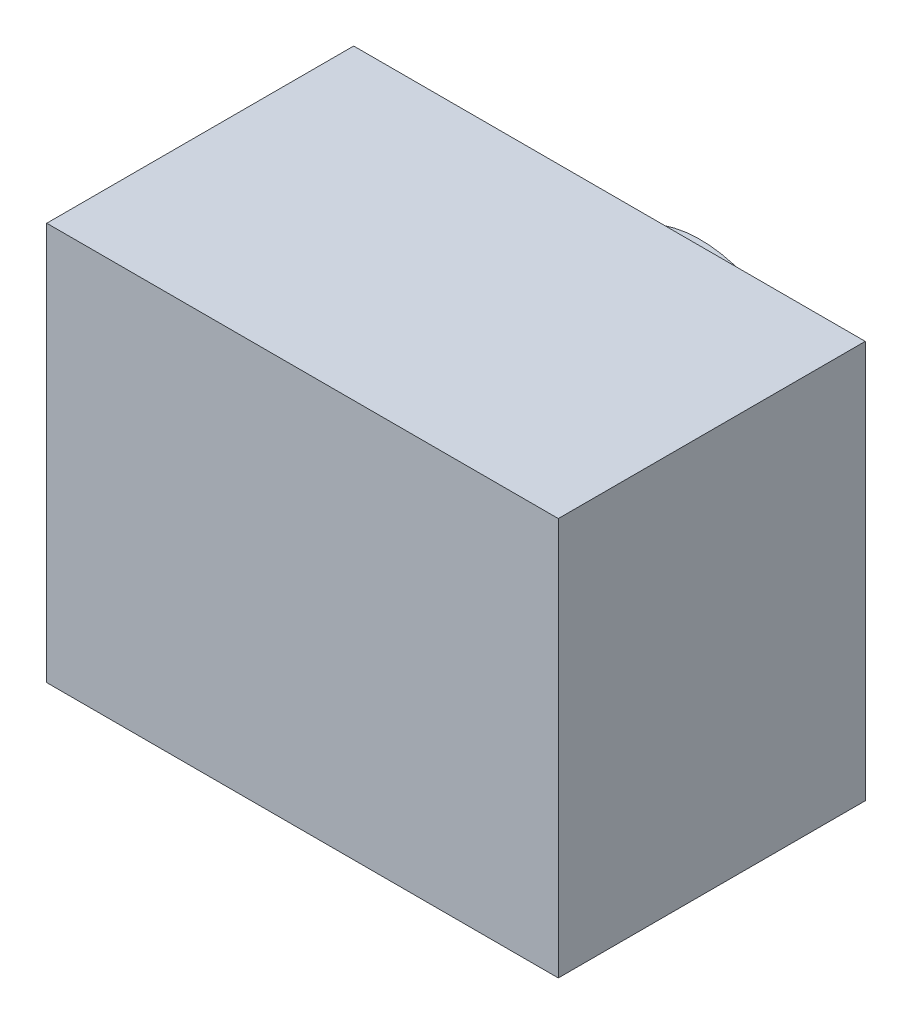
ISO-10303-21;
HEADER;
FILE_DESCRIPTION(('STEP AP214'),'2;1');
FILE_NAME('part.step','',(''),(''),'','','');
FILE_SCHEMA(('AUTOMOTIVE_DESIGN { 1 0 10303 214 1 1 1 1 }'));
ENDSEC;
DATA;
#1=APPLICATION_CONTEXT('core data for automotive mechanical design processes');
#2=APPLICATION_PROTOCOL_DEFINITION('international standard','automotive_design',2000,#1);
#3=PRODUCT_CONTEXT('',#1,'mechanical');
#4=PRODUCT('Part','Part','',(#3));
#5=PRODUCT_RELATED_PRODUCT_CATEGORY('part','',(#4));
#6=PRODUCT_DEFINITION_FORMATION('','',#4);
#7=PRODUCT_DEFINITION_CONTEXT('part definition',#1,'design');
#8=PRODUCT_DEFINITION('design','',#6,#7);
#9=PRODUCT_DEFINITION_SHAPE('','',#8);
#10=(LENGTH_UNIT() NAMED_UNIT(*) SI_UNIT(.MILLI.,.METRE.));
#11=(NAMED_UNIT(*) PLANE_ANGLE_UNIT() SI_UNIT($,.RADIAN.));
#12=(NAMED_UNIT(*) SI_UNIT($,.STERADIAN.) SOLID_ANGLE_UNIT());
#13=UNCERTAINTY_MEASURE_WITH_UNIT(LENGTH_MEASURE(1.E-05),#10,'distance_accuracy_value','');
#14=(GEOMETRIC_REPRESENTATION_CONTEXT(3) GLOBAL_UNCERTAINTY_ASSIGNED_CONTEXT((#13)) GLOBAL_UNIT_ASSIGNED_CONTEXT((#10,
#11,#12)) REPRESENTATION_CONTEXT('',''));
#15=CARTESIAN_POINT('',(0.,0.,0.));
#16=DIRECTION('',(0.,0.,1.));
#17=DIRECTION('',(1.,0.,0.));
#18=AXIS2_PLACEMENT_3D('',#15,#16,#17);
#19=CARTESIAN_POINT('',(0.,0.,0.));
#20=DIRECTION('',(0.,0.,1.));
#21=DIRECTION('',(1.,0.,0.));
#22=AXIS2_PLACEMENT_3D('',#19,#20,#21);
#23=PLANE('',#22);
#24=DIRECTION('',(-1.,0.,0.));
#25=VECTOR('',#24,1.);
#26=CARTESIAN_POINT('',(2.25,1.75,0.));
#27=LINE('',#26,#25);
#28=CARTESIAN_POINT('',(2.25,1.75,0.));
#29=VERTEX_POINT('',#28);
#30=CARTESIAN_POINT('',(-2.25,1.75,0.));
#31=VERTEX_POINT('',#30);
#32=EDGE_CURVE('E81',#29,#31,#27,.T.);
#33=ORIENTED_EDGE('',*,*,#32,.F.);
#34=DIRECTION('',(0.,1.,0.));
#35=VECTOR('',#34,1.);
#36=CARTESIAN_POINT('',(2.25,-1.75,0.));
#37=LINE('',#36,#35);
#38=CARTESIAN_POINT('',(2.25,-1.75,0.));
#39=VERTEX_POINT('',#38);
#40=EDGE_CURVE('E36',#39,#29,#37,.T.);
#41=ORIENTED_EDGE('',*,*,#40,.F.);
#42=DIRECTION('',(1.,0.,0.));
#43=VECTOR('',#42,1.);
#44=CARTESIAN_POINT('',(-2.25,-1.75,0.));
#45=LINE('',#44,#43);
#46=CARTESIAN_POINT('',(-2.25,-1.75,0.));
#47=VERTEX_POINT('',#46);
#48=EDGE_CURVE('E74',#47,#39,#45,.T.);
#49=ORIENTED_EDGE('',*,*,#48,.F.);
#50=DIRECTION('',(0.,-1.,0.));
#51=VECTOR('',#50,1.);
#52=CARTESIAN_POINT('',(-2.25,1.75,0.));
#53=LINE('',#52,#51);
#54=EDGE_CURVE('E27',#31,#47,#53,.T.);
#55=ORIENTED_EDGE('',*,*,#54,.F.);
#56=EDGE_LOOP('',(#33,#41,#49,#55));
#57=FACE_BOUND('',#56,.T.);
#58=CARTESIAN_POINT('',(0.,0.,0.));
#59=DIRECTION('',(0.,0.,-1.));
#60=DIRECTION('',(1.,0.,0.));
#61=AXIS2_PLACEMENT_3D('',#58,#59,#60);
#62=CIRCLE('',#61,1.);
#63=CARTESIAN_POINT('',(1.,0.,0.));
#64=VERTEX_POINT('',#63);
#65=EDGE_CURVE('E85',#64,#64,#62,.T.);
#66=ORIENTED_EDGE('',*,*,#65,.F.);
#67=EDGE_LOOP('',(#66));
#68=FACE_BOUND('',#67,.T.);
#69=ADVANCED_FACE('F17',(#57,#68),#23,.F.);
#70=CARTESIAN_POINT('',(-2.25,1.75,0.));
#71=DIRECTION('',(-1.,0.,0.));
#72=DIRECTION('',(0.,-1.,0.));
#73=AXIS2_PLACEMENT_3D('',#70,#71,#72);
#74=PLANE('',#73);
#75=DIRECTION('',(0.,0.,1.));
#76=VECTOR('',#75,1.);
#77=CARTESIAN_POINT('',(-2.25,-1.75,0.));
#78=LINE('',#77,#76);
#79=CARTESIAN_POINT('',(-2.25,-1.75,2.7));
#80=VERTEX_POINT('',#79);
#81=EDGE_CURVE('E11',#47,#80,#78,.T.);
#82=ORIENTED_EDGE('',*,*,#81,.T.);
#83=DIRECTION('',(0.,-1.,0.));
#84=VECTOR('',#83,1.);
#85=CARTESIAN_POINT('',(-2.25,1.75,2.7));
#86=LINE('',#85,#84);
#87=CARTESIAN_POINT('',(-2.25,1.75,2.7));
#88=VERTEX_POINT('',#87);
#89=EDGE_CURVE('E77',#88,#80,#86,.T.);
#90=ORIENTED_EDGE('',*,*,#89,.F.);
#91=DIRECTION('',(0.,0.,1.));
#92=VECTOR('',#91,1.);
#93=CARTESIAN_POINT('',(-2.25,1.75,0.));
#94=LINE('',#93,#92);
#95=EDGE_CURVE('E83',#31,#88,#94,.T.);
#96=ORIENTED_EDGE('',*,*,#95,.F.);
#97=ORIENTED_EDGE('',*,*,#54,.T.);
#98=EDGE_LOOP('',(#82,#90,#96,#97));
#99=FACE_BOUND('',#98,.T.);
#100=ADVANCED_FACE('F98',(#99),#74,.T.);
#101=CARTESIAN_POINT('',(2.25,1.75,0.));
#102=DIRECTION('',(0.,1.,0.));
#103=DIRECTION('',(-1.,0.,0.));
#104=AXIS2_PLACEMENT_3D('',#101,#102,#103);
#105=PLANE('',#104);
#106=ORIENTED_EDGE('',*,*,#95,.T.);
#107=DIRECTION('',(-1.,0.,0.));
#108=VECTOR('',#107,1.);
#109=CARTESIAN_POINT('',(2.25,1.75,2.7));
#110=LINE('',#109,#108);
#111=CARTESIAN_POINT('',(2.25,1.75,2.7));
#112=VERTEX_POINT('',#111);
#113=EDGE_CURVE('E58',#112,#88,#110,.T.);
#114=ORIENTED_EDGE('',*,*,#113,.F.);
#115=DIRECTION('',(0.,0.,1.));
#116=VECTOR('',#115,1.);
#117=CARTESIAN_POINT('',(2.25,1.75,0.));
#118=LINE('',#117,#116);
#119=EDGE_CURVE('E65',#29,#112,#118,.T.);
#120=ORIENTED_EDGE('',*,*,#119,.F.);
#121=ORIENTED_EDGE('',*,*,#32,.T.);
#122=EDGE_LOOP('',(#106,#114,#120,#121));
#123=FACE_BOUND('',#122,.T.);
#124=ADVANCED_FACE('F93',(#123),#105,.T.);
#125=CARTESIAN_POINT('',(2.25,-1.75,0.));
#126=DIRECTION('',(1.,0.,0.));
#127=DIRECTION('',(0.,1.,0.));
#128=AXIS2_PLACEMENT_3D('',#125,#126,#127);
#129=PLANE('',#128);
#130=ORIENTED_EDGE('',*,*,#119,.T.);
#131=DIRECTION('',(0.,1.,0.));
#132=VECTOR('',#131,1.);
#133=CARTESIAN_POINT('',(2.25,-1.75,2.7));
#134=LINE('',#133,#132);
#135=CARTESIAN_POINT('',(2.25,-1.75,2.7));
#136=VERTEX_POINT('',#135);
#137=EDGE_CURVE('E61',#136,#112,#134,.T.);
#138=ORIENTED_EDGE('',*,*,#137,.F.);
#139=DIRECTION('',(0.,0.,1.));
#140=VECTOR('',#139,1.);
#141=CARTESIAN_POINT('',(2.25,-1.75,0.));
#142=LINE('',#141,#140);
#143=EDGE_CURVE('E64',#39,#136,#142,.T.);
#144=ORIENTED_EDGE('',*,*,#143,.F.);
#145=ORIENTED_EDGE('',*,*,#40,.T.);
#146=EDGE_LOOP('',(#130,#138,#144,#145));
#147=FACE_BOUND('',#146,.T.);
#148=ADVANCED_FACE('F63',(#147),#129,.T.);
#149=CARTESIAN_POINT('',(-2.25,-1.75,0.));
#150=DIRECTION('',(0.,-1.,0.));
#151=DIRECTION('',(1.,0.,0.));
#152=AXIS2_PLACEMENT_3D('',#149,#150,#151);
#153=PLANE('',#152);
#154=ORIENTED_EDGE('',*,*,#143,.T.);
#155=DIRECTION('',(1.,0.,0.));
#156=VECTOR('',#155,1.);
#157=CARTESIAN_POINT('',(-2.25,-1.75,2.7));
#158=LINE('',#157,#156);
#159=EDGE_CURVE('E68',#80,#136,#158,.T.);
#160=ORIENTED_EDGE('',*,*,#159,.F.);
#161=ORIENTED_EDGE('',*,*,#81,.F.);
#162=ORIENTED_EDGE('',*,*,#48,.T.);
#163=EDGE_LOOP('',(#154,#160,#161,#162));
#164=FACE_BOUND('',#163,.T.);
#165=ADVANCED_FACE('F72',(#164),#153,.T.);
#166=CARTESIAN_POINT('',(0.,0.,2.7));
#167=DIRECTION('',(0.,0.,1.));
#168=DIRECTION('',(1.,0.,0.));
#169=AXIS2_PLACEMENT_3D('',#166,#167,#168);
#170=PLANE('',#169);
#171=ORIENTED_EDGE('',*,*,#159,.T.);
#172=ORIENTED_EDGE('',*,*,#137,.T.);
#173=ORIENTED_EDGE('',*,*,#113,.T.);
#174=ORIENTED_EDGE('',*,*,#89,.T.);
#175=EDGE_LOOP('',(#171,#172,#173,#174));
#176=FACE_BOUND('',#175,.T.);
#177=ADVANCED_FACE('F76',(#176),#170,.T.);
#178=CARTESIAN_POINT('',(0.,0.,0.));
#179=DIRECTION('',(0.,0.,-1.));
#180=DIRECTION('',(-1.,0.,0.));
#181=AXIS2_PLACEMENT_3D('',#178,#179,#180);
#182=CYLINDRICAL_SURFACE('',#181,1.);
#183=CARTESIAN_POINT('',(0.,0.,-0.8));
#184=DIRECTION('',(0.,0.,-1.));
#185=DIRECTION('',(-1.,0.,0.));
#186=AXIS2_PLACEMENT_3D('',#183,#184,#185);
#187=CIRCLE('',#186,1.);
#188=CARTESIAN_POINT('',(-1.,0.,-0.8));
#189=VERTEX_POINT('',#188);
#190=EDGE_CURVE('E21',#189,#189,#187,.T.);
#191=ORIENTED_EDGE('',*,*,#190,.F.);
#192=EDGE_LOOP('',(#191));
#193=FACE_BOUND('',#192,.T.);
#194=ORIENTED_EDGE('',*,*,#65,.T.);
#195=EDGE_LOOP('',(#194));
#196=FACE_BOUND('',#195,.T.);
#197=ADVANCED_FACE('F114',(#193,#196),#182,.T.);
#198=CARTESIAN_POINT('',(0.,0.,-0.8));
#199=DIRECTION('',(0.,0.,-1.));
#200=DIRECTION('',(-1.,0.,0.));
#201=AXIS2_PLACEMENT_3D('',#198,#199,#200);
#202=PLANE('',#201);
#203=ORIENTED_EDGE('',*,*,#190,.T.);
#204=EDGE_LOOP('',(#203));
#205=FACE_BOUND('',#204,.T.);
#206=ADVANCED_FACE('F19',(#205),#202,.T.);
#207=CLOSED_SHELL('',(#69,#100,#124,#148,#165,#177,#197,#206));
#208=MANIFOLD_SOLID_BREP('B1',#207);
#209=ADVANCED_BREP_SHAPE_REPRESENTATION('',(#18,#208),#14);
#210=SHAPE_DEFINITION_REPRESENTATION(#9,#209);
ENDSEC;
END-ISO-10303-21;
